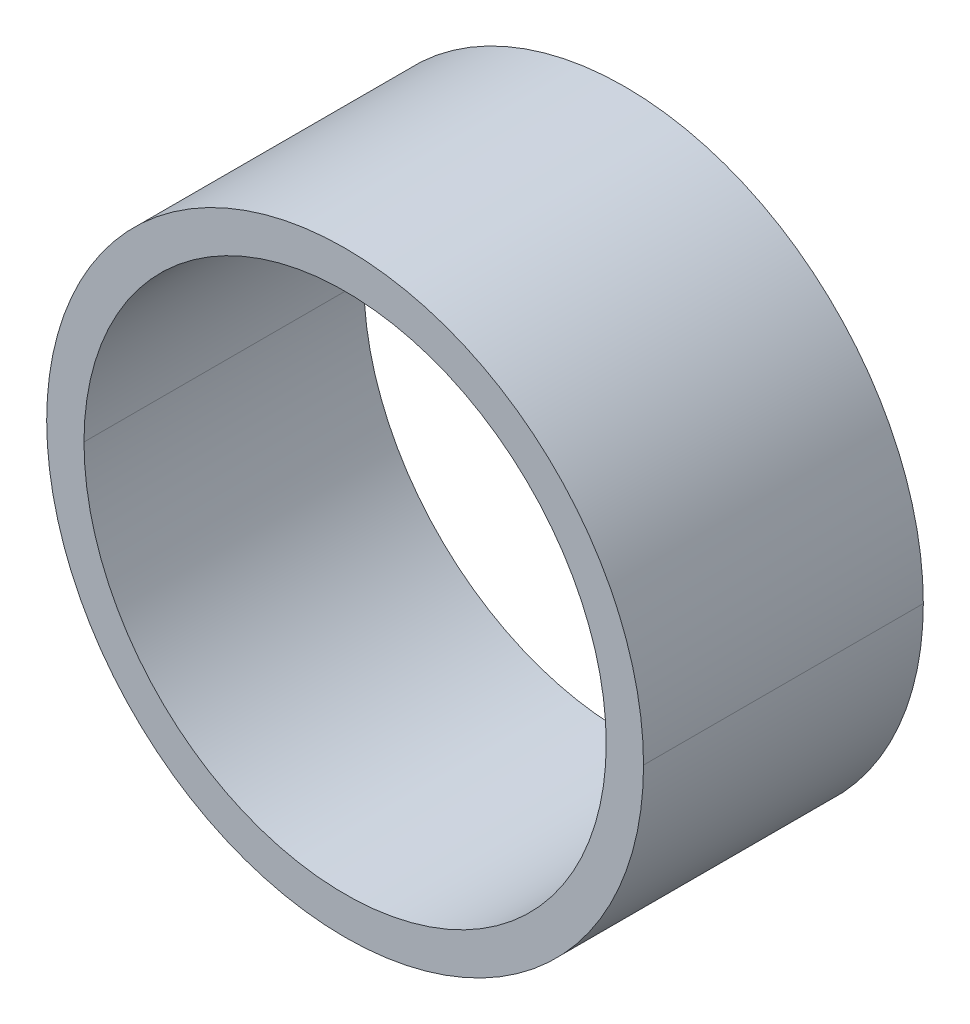
ISO-10303-21;
HEADER;
FILE_DESCRIPTION(('STEP AP214'),'2;1');
FILE_NAME('part.step','',(''),(''),'','','');
FILE_SCHEMA(('AUTOMOTIVE_DESIGN { 1 0 10303 214 1 1 1 1 }'));
ENDSEC;
DATA;
#1=APPLICATION_CONTEXT('core data for automotive mechanical design processes');
#2=APPLICATION_PROTOCOL_DEFINITION('international standard','automotive_design',2000,#1);
#3=PRODUCT_CONTEXT('',#1,'mechanical');
#4=PRODUCT('Part','Part','',(#3));
#5=PRODUCT_RELATED_PRODUCT_CATEGORY('part','',(#4));
#6=PRODUCT_DEFINITION_FORMATION('','',#4);
#7=PRODUCT_DEFINITION_CONTEXT('part definition',#1,'design');
#8=PRODUCT_DEFINITION('design','',#6,#7);
#9=PRODUCT_DEFINITION_SHAPE('','',#8);
#10=(LENGTH_UNIT() NAMED_UNIT(*) SI_UNIT(.MILLI.,.METRE.));
#11=(NAMED_UNIT(*) PLANE_ANGLE_UNIT() SI_UNIT($,.RADIAN.));
#12=(NAMED_UNIT(*) SI_UNIT($,.STERADIAN.) SOLID_ANGLE_UNIT());
#13=UNCERTAINTY_MEASURE_WITH_UNIT(LENGTH_MEASURE(1.E-05),#10,'distance_accuracy_value','');
#14=(GEOMETRIC_REPRESENTATION_CONTEXT(3) GLOBAL_UNCERTAINTY_ASSIGNED_CONTEXT((#13)) GLOBAL_UNIT_ASSIGNED_CONTEXT((#10,
#11,#12)) REPRESENTATION_CONTEXT('',''));
#15=CARTESIAN_POINT('',(0.,0.,0.));
#16=DIRECTION('',(0.,0.,1.));
#17=DIRECTION('',(1.,0.,0.));
#18=AXIS2_PLACEMENT_3D('',#15,#16,#17);
#19=CARTESIAN_POINT('',(0.,0.,19.05));
#20=DIRECTION('',(0.,0.,-1.));
#21=DIRECTION('',(-1.,0.,0.));
#22=AXIS2_PLACEMENT_3D('',#19,#20,#21);
#23=CYLINDRICAL_SURFACE('',#22,20.32);
#24=CARTESIAN_POINT('',(0.,0.,19.05));
#25=DIRECTION('',(0.,0.,1.));
#26=DIRECTION('',(1.,0.,0.));
#27=AXIS2_PLACEMENT_3D('',#24,#25,#26);
#28=CIRCLE('',#27,20.32);
#29=CARTESIAN_POINT('',(-20.32,0.,19.05));
#30=VERTEX_POINT('',#29);
#31=CARTESIAN_POINT('',(20.32,0.,19.05));
#32=VERTEX_POINT('',#31);
#33=EDGE_CURVE('E107',#30,#32,#28,.T.);
#34=ORIENTED_EDGE('',*,*,#33,.F.);
#35=DIRECTION('',(0.,0.,-1.));
#36=VECTOR('',#35,1.);
#37=CARTESIAN_POINT('',(-20.32,0.,19.05));
#38=LINE('',#37,#36);
#39=CARTESIAN_POINT('',(-20.32,0.,0.));
#40=VERTEX_POINT('',#39);
#41=EDGE_CURVE('E11',#30,#40,#38,.T.);
#42=ORIENTED_EDGE('',*,*,#41,.T.);
#43=CARTESIAN_POINT('',(0.,0.,0.));
#44=DIRECTION('',(0.,0.,1.));
#45=DIRECTION('',(1.,0.,0.));
#46=AXIS2_PLACEMENT_3D('',#43,#44,#45);
#47=CIRCLE('',#46,20.32);
#48=CARTESIAN_POINT('',(20.32,0.,0.));
#49=VERTEX_POINT('',#48);
#50=EDGE_CURVE('E100',#40,#49,#47,.T.);
#51=ORIENTED_EDGE('',*,*,#50,.T.);
#52=DIRECTION('',(0.,0.,1.));
#53=VECTOR('',#52,1.);
#54=CARTESIAN_POINT('',(20.32,0.,19.05));
#55=LINE('',#54,#53);
#56=EDGE_CURVE('E50',#49,#32,#55,.T.);
#57=ORIENTED_EDGE('',*,*,#56,.T.);
#58=EDGE_LOOP('',(#34,#42,#51,#57));
#59=FACE_BOUND('',#58,.T.);
#60=ADVANCED_FACE('F41',(#59),#23,.T.);
#61=CARTESIAN_POINT('',(0.,0.,19.05));
#62=DIRECTION('',(0.,0.,-1.));
#63=DIRECTION('',(-1.,0.,0.));
#64=AXIS2_PLACEMENT_3D('',#61,#62,#63);
#65=CYLINDRICAL_SURFACE('',#64,17.78);
#66=CARTESIAN_POINT('',(0.,0.,19.05));
#67=DIRECTION('',(0.,0.,1.));
#68=DIRECTION('',(1.,0.,0.));
#69=AXIS2_PLACEMENT_3D('',#66,#67,#68);
#70=CIRCLE('',#69,17.78);
#71=CARTESIAN_POINT('',(-17.78,0.,19.05));
#72=VERTEX_POINT('',#71);
#73=CARTESIAN_POINT('',(17.78,0.,19.05));
#74=VERTEX_POINT('',#73);
#75=EDGE_CURVE('E90',#72,#74,#70,.T.);
#76=ORIENTED_EDGE('',*,*,#75,.T.);
#77=DIRECTION('',(0.,0.,-1.));
#78=VECTOR('',#77,1.);
#79=CARTESIAN_POINT('',(17.78,0.,19.05));
#80=LINE('',#79,#78);
#81=CARTESIAN_POINT('',(17.78,0.,0.));
#82=VERTEX_POINT('',#81);
#83=EDGE_CURVE('E86',#74,#82,#80,.T.);
#84=ORIENTED_EDGE('',*,*,#83,.T.);
#85=CARTESIAN_POINT('',(0.,0.,0.));
#86=DIRECTION('',(0.,0.,1.));
#87=DIRECTION('',(1.,0.,0.));
#88=AXIS2_PLACEMENT_3D('',#85,#86,#87);
#89=CIRCLE('',#88,17.78);
#90=CARTESIAN_POINT('',(-17.78,0.,0.));
#91=VERTEX_POINT('',#90);
#92=EDGE_CURVE('E91',#91,#82,#89,.T.);
#93=ORIENTED_EDGE('',*,*,#92,.F.);
#94=DIRECTION('',(0.,0.,1.));
#95=VECTOR('',#94,1.);
#96=CARTESIAN_POINT('',(-17.78,0.,19.05));
#97=LINE('',#96,#95);
#98=EDGE_CURVE('E84',#91,#72,#97,.T.);
#99=ORIENTED_EDGE('',*,*,#98,.T.);
#100=EDGE_LOOP('',(#76,#84,#93,#99));
#101=FACE_BOUND('',#100,.T.);
#102=ADVANCED_FACE('F94',(#101),#65,.F.);
#103=CARTESIAN_POINT('',(0.,0.,19.05));
#104=DIRECTION('',(0.,0.,1.));
#105=DIRECTION('',(1.,0.,0.));
#106=AXIS2_PLACEMENT_3D('',#103,#104,#105);
#107=PLANE('',#106);
#108=EDGE_CURVE('E97',#32,#30,#28,.T.);
#109=ORIENTED_EDGE('',*,*,#108,.T.);
#110=ORIENTED_EDGE('',*,*,#33,.T.);
#111=EDGE_LOOP('',(#109,#110));
#112=FACE_BOUND('',#111,.T.);
#113=ORIENTED_EDGE('',*,*,#75,.F.);
#114=EDGE_CURVE('E80',#74,#72,#70,.T.);
#115=ORIENTED_EDGE('',*,*,#114,.F.);
#116=EDGE_LOOP('',(#113,#115));
#117=FACE_BOUND('',#116,.T.);
#118=ADVANCED_FACE('F99',(#112,#117),#107,.T.);
#119=CARTESIAN_POINT('',(0.,0.,0.));
#120=DIRECTION('',(0.,0.,1.));
#121=DIRECTION('',(1.,0.,0.));
#122=AXIS2_PLACEMENT_3D('',#119,#120,#121);
#123=PLANE('',#122);
#124=EDGE_CURVE('E101',#49,#40,#47,.T.);
#125=ORIENTED_EDGE('',*,*,#124,.F.);
#126=ORIENTED_EDGE('',*,*,#50,.F.);
#127=EDGE_LOOP('',(#125,#126));
#128=FACE_BOUND('',#127,.T.);
#129=ORIENTED_EDGE('',*,*,#92,.T.);
#130=EDGE_CURVE('E105',#82,#91,#89,.T.);
#131=ORIENTED_EDGE('',*,*,#130,.T.);
#132=EDGE_LOOP('',(#129,#131));
#133=FACE_BOUND('',#132,.T.);
#134=ADVANCED_FACE('F119',(#128,#133),#123,.F.);
#135=ORIENTED_EDGE('',*,*,#41,.F.);
#136=ORIENTED_EDGE('',*,*,#108,.F.);
#137=ORIENTED_EDGE('',*,*,#56,.F.);
#138=ORIENTED_EDGE('',*,*,#124,.T.);
#139=EDGE_LOOP('',(#135,#136,#137,#138));
#140=FACE_BOUND('',#139,.T.);
#141=ADVANCED_FACE('F43',(#140),#23,.T.);
#142=ORIENTED_EDGE('',*,*,#83,.F.);
#143=ORIENTED_EDGE('',*,*,#114,.T.);
#144=ORIENTED_EDGE('',*,*,#98,.F.);
#145=ORIENTED_EDGE('',*,*,#130,.F.);
#146=EDGE_LOOP('',(#142,#143,#144,#145));
#147=FACE_BOUND('',#146,.T.);
#148=ADVANCED_FACE('F82',(#147),#65,.F.);
#149=CLOSED_SHELL('',(#60,#102,#118,#134,#141,#148));
#150=MANIFOLD_SOLID_BREP('B2',#149);
#151=ADVANCED_BREP_SHAPE_REPRESENTATION('',(#18,#150),#14);
#152=SHAPE_DEFINITION_REPRESENTATION(#9,#151);
ENDSEC;
END-ISO-10303-21;
